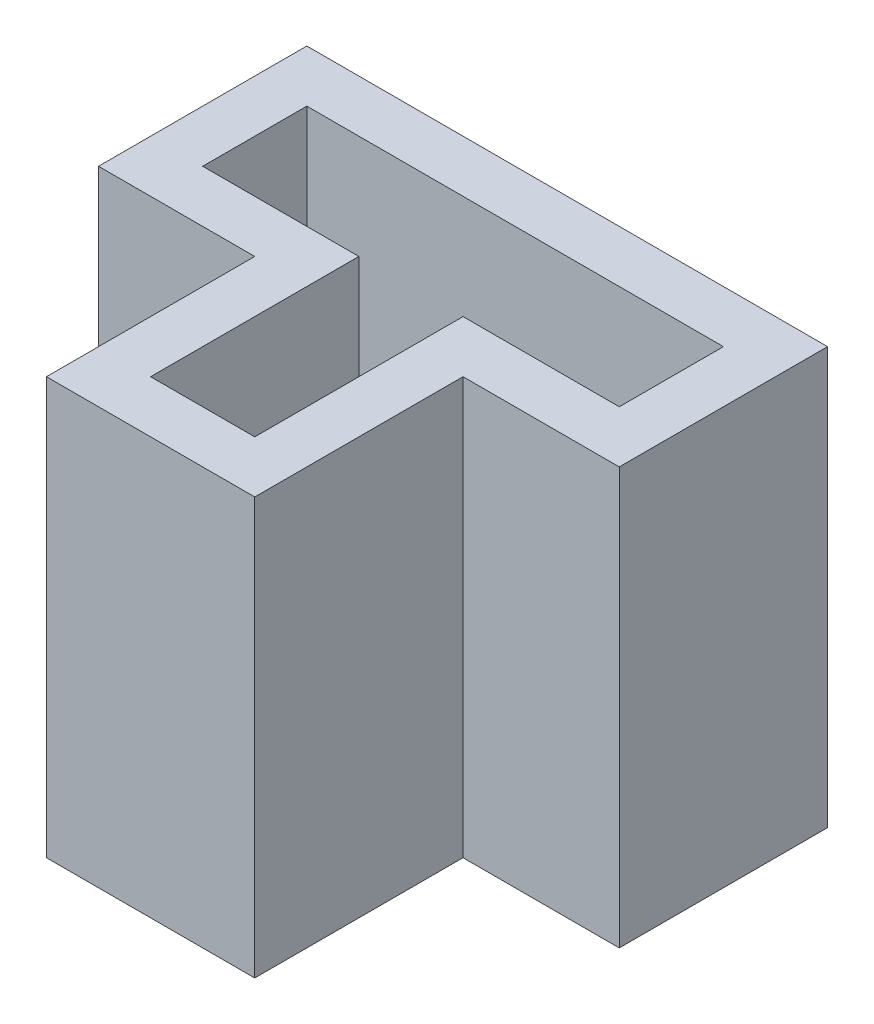
ISO-10303-21;
HEADER;
FILE_DESCRIPTION(('STEP AP214'),'2;1');
FILE_NAME('part.step','',(''),(''),'','','');
FILE_SCHEMA(('AUTOMOTIVE_DESIGN { 1 0 10303 214 1 1 1 1 }'));
ENDSEC;
DATA;
#1=APPLICATION_CONTEXT('core data for automotive mechanical design processes');
#2=APPLICATION_PROTOCOL_DEFINITION('international standard','automotive_design',2000,#1);
#3=PRODUCT_CONTEXT('',#1,'mechanical');
#4=PRODUCT('Part','Part','',(#3));
#5=PRODUCT_RELATED_PRODUCT_CATEGORY('part','',(#4));
#6=PRODUCT_DEFINITION_FORMATION('','',#4);
#7=PRODUCT_DEFINITION_CONTEXT('part definition',#1,'design');
#8=PRODUCT_DEFINITION('design','',#6,#7);
#9=PRODUCT_DEFINITION_SHAPE('','',#8);
#10=(LENGTH_UNIT() NAMED_UNIT(*) SI_UNIT(.MILLI.,.METRE.));
#11=(NAMED_UNIT(*) PLANE_ANGLE_UNIT() SI_UNIT($,.RADIAN.));
#12=(NAMED_UNIT(*) SI_UNIT($,.STERADIAN.) SOLID_ANGLE_UNIT());
#13=UNCERTAINTY_MEASURE_WITH_UNIT(LENGTH_MEASURE(1.E-05),#10,'distance_accuracy_value','');
#14=(GEOMETRIC_REPRESENTATION_CONTEXT(3) GLOBAL_UNCERTAINTY_ASSIGNED_CONTEXT((#13)) GLOBAL_UNIT_ASSIGNED_CONTEXT((#10,
#11,#12)) REPRESENTATION_CONTEXT('',''));
#15=CARTESIAN_POINT('',(0.,0.,0.));
#16=DIRECTION('',(0.,0.,1.));
#17=DIRECTION('',(1.,0.,0.));
#18=AXIS2_PLACEMENT_3D('',#15,#16,#17);
#19=CARTESIAN_POINT('',(32.948717948718,-40.,15.8119658119658));
#20=DIRECTION('',(1.,0.,0.));
#21=DIRECTION('',(0.,0.,-1.));
#22=AXIS2_PLACEMENT_3D('',#19,#20,#21);
#23=PLANE('',#22);
#24=DIRECTION('',(0.,0.,-1.));
#25=VECTOR('',#24,1.);
#26=CARTESIAN_POINT('',(32.948717948718,0.,15.8119658119658));
#27=LINE('',#26,#25);
#28=CARTESIAN_POINT('',(32.948717948718,0.,15.8119658119658));
#29=VERTEX_POINT('',#28);
#30=CARTESIAN_POINT('',(32.948717948718,0.,-4.1880341880342));
#31=VERTEX_POINT('',#30);
#32=EDGE_CURVE('E229',#29,#31,#27,.T.);
#33=ORIENTED_EDGE('',*,*,#32,.F.);
#34=DIRECTION('',(0.,1.,0.));
#35=VECTOR('',#34,1.);
#36=CARTESIAN_POINT('',(32.948717948718,-40.,15.8119658119658));
#37=LINE('',#36,#35);
#38=CARTESIAN_POINT('',(32.948717948718,-40.,15.8119658119658));
#39=VERTEX_POINT('',#38);
#40=EDGE_CURVE('E11',#39,#29,#37,.T.);
#41=ORIENTED_EDGE('',*,*,#40,.F.);
#42=DIRECTION('',(0.,0.,-1.));
#43=VECTOR('',#42,1.);
#44=CARTESIAN_POINT('',(32.948717948718,-40.,15.8119658119658));
#45=LINE('',#44,#43);
#46=CARTESIAN_POINT('',(32.948717948718,-40.,-4.1880341880342));
#47=VERTEX_POINT('',#46);
#48=EDGE_CURVE('E247',#39,#47,#45,.T.);
#49=ORIENTED_EDGE('',*,*,#48,.T.);
#50=DIRECTION('',(0.,1.,0.));
#51=VECTOR('',#50,1.);
#52=CARTESIAN_POINT('',(32.948717948718,-40.,-4.1880341880342));
#53=LINE('',#52,#51);
#54=EDGE_CURVE('E43',#47,#31,#53,.T.);
#55=ORIENTED_EDGE('',*,*,#54,.T.);
#56=EDGE_LOOP('',(#33,#41,#49,#55));
#57=FACE_BOUND('',#56,.T.);
#58=ADVANCED_FACE('F40',(#57),#23,.T.);
#59=CARTESIAN_POINT('',(17.948717948718,-40.,15.8119658119658));
#60=DIRECTION('',(0.,0.,1.));
#61=DIRECTION('',(1.,0.,0.));
#62=AXIS2_PLACEMENT_3D('',#59,#60,#61);
#63=PLANE('',#62);
#64=DIRECTION('',(1.,0.,0.));
#65=VECTOR('',#64,1.);
#66=CARTESIAN_POINT('',(17.948717948718,0.,15.8119658119658));
#67=LINE('',#66,#65);
#68=CARTESIAN_POINT('',(17.948717948718,0.,15.8119658119658));
#69=VERTEX_POINT('',#68);
#70=EDGE_CURVE('E252',#69,#29,#67,.T.);
#71=ORIENTED_EDGE('',*,*,#70,.F.);
#72=DIRECTION('',(0.,1.,0.));
#73=VECTOR('',#72,1.);
#74=CARTESIAN_POINT('',(17.948717948718,-40.,15.8119658119658));
#75=LINE('',#74,#73);
#76=CARTESIAN_POINT('',(17.948717948718,-40.,15.8119658119658));
#77=VERTEX_POINT('',#76);
#78=EDGE_CURVE('E49',#77,#69,#75,.T.);
#79=ORIENTED_EDGE('',*,*,#78,.F.);
#80=DIRECTION('',(1.,0.,0.));
#81=VECTOR('',#80,1.);
#82=CARTESIAN_POINT('',(17.948717948718,-40.,15.8119658119658));
#83=LINE('',#82,#81);
#84=EDGE_CURVE('E276',#77,#39,#83,.T.);
#85=ORIENTED_EDGE('',*,*,#84,.T.);
#86=ORIENTED_EDGE('',*,*,#40,.T.);
#87=EDGE_LOOP('',(#71,#79,#85,#86));
#88=FACE_BOUND('',#87,.T.);
#89=ADVANCED_FACE('F339',(#88),#63,.T.);
#90=CARTESIAN_POINT('',(17.948717948718,-40.,35.8119658119658));
#91=DIRECTION('',(1.,0.,0.));
#92=DIRECTION('',(0.,0.,-1.));
#93=AXIS2_PLACEMENT_3D('',#90,#91,#92);
#94=PLANE('',#93);
#95=DIRECTION('',(0.,0.,-1.));
#96=VECTOR('',#95,1.);
#97=CARTESIAN_POINT('',(17.948717948718,0.,35.8119658119658));
#98=LINE('',#97,#96);
#99=CARTESIAN_POINT('',(17.948717948718,0.,35.8119658119658));
#100=VERTEX_POINT('',#99);
#101=EDGE_CURVE('E303',#100,#69,#98,.T.);
#102=ORIENTED_EDGE('',*,*,#101,.F.);
#103=DIRECTION('',(0.,1.,0.));
#104=VECTOR('',#103,1.);
#105=CARTESIAN_POINT('',(17.948717948718,-40.,35.8119658119658));
#106=LINE('',#105,#104);
#107=CARTESIAN_POINT('',(17.948717948718,-40.,35.8119658119658));
#108=VERTEX_POINT('',#107);
#109=EDGE_CURVE('E312',#108,#100,#106,.T.);
#110=ORIENTED_EDGE('',*,*,#109,.F.);
#111=DIRECTION('',(0.,0.,-1.));
#112=VECTOR('',#111,1.);
#113=CARTESIAN_POINT('',(17.948717948718,-40.,35.8119658119658));
#114=LINE('',#113,#112);
#115=EDGE_CURVE('E272',#108,#77,#114,.T.);
#116=ORIENTED_EDGE('',*,*,#115,.T.);
#117=ORIENTED_EDGE('',*,*,#78,.T.);
#118=EDGE_LOOP('',(#102,#110,#116,#117));
#119=FACE_BOUND('',#118,.T.);
#120=ADVANCED_FACE('F358',(#119),#94,.T.);
#121=CARTESIAN_POINT('',(-2.05128205128204,-40.,35.8119658119658));
#122=DIRECTION('',(0.,0.,1.));
#123=DIRECTION('',(1.,0.,0.));
#124=AXIS2_PLACEMENT_3D('',#121,#122,#123);
#125=PLANE('',#124);
#126=DIRECTION('',(1.,0.,0.));
#127=VECTOR('',#126,1.);
#128=CARTESIAN_POINT('',(-2.05128205128204,0.,35.8119658119658));
#129=LINE('',#128,#127);
#130=CARTESIAN_POINT('',(-2.05128205128204,0.,35.8119658119658));
#131=VERTEX_POINT('',#130);
#132=EDGE_CURVE('E299',#131,#100,#129,.T.);
#133=ORIENTED_EDGE('',*,*,#132,.F.);
#134=DIRECTION('',(0.,1.,0.));
#135=VECTOR('',#134,1.);
#136=CARTESIAN_POINT('',(-2.05128205128204,-40.,35.8119658119658));
#137=LINE('',#136,#135);
#138=CARTESIAN_POINT('',(-2.05128205128204,-40.,35.8119658119658));
#139=VERTEX_POINT('',#138);
#140=EDGE_CURVE('E315',#139,#131,#137,.T.);
#141=ORIENTED_EDGE('',*,*,#140,.F.);
#142=DIRECTION('',(1.,0.,0.));
#143=VECTOR('',#142,1.);
#144=CARTESIAN_POINT('',(-2.05128205128204,-40.,35.8119658119658));
#145=LINE('',#144,#143);
#146=EDGE_CURVE('E268',#139,#108,#145,.T.);
#147=ORIENTED_EDGE('',*,*,#146,.T.);
#148=ORIENTED_EDGE('',*,*,#109,.T.);
#149=EDGE_LOOP('',(#133,#141,#147,#148));
#150=FACE_BOUND('',#149,.T.);
#151=ADVANCED_FACE('F356',(#150),#125,.T.);
#152=CARTESIAN_POINT('',(-2.05128205128204,-40.,15.8119658119658));
#153=DIRECTION('',(-1.,0.,0.));
#154=DIRECTION('',(0.,0.,1.));
#155=AXIS2_PLACEMENT_3D('',#152,#153,#154);
#156=PLANE('',#155);
#157=DIRECTION('',(0.,0.,1.));
#158=VECTOR('',#157,1.);
#159=CARTESIAN_POINT('',(-2.05128205128204,0.,15.8119658119658));
#160=LINE('',#159,#158);
#161=CARTESIAN_POINT('',(-2.05128205128204,0.,15.8119658119658));
#162=VERTEX_POINT('',#161);
#163=EDGE_CURVE('E295',#162,#131,#160,.T.);
#164=ORIENTED_EDGE('',*,*,#163,.F.);
#165=DIRECTION('',(0.,1.,0.));
#166=VECTOR('',#165,1.);
#167=CARTESIAN_POINT('',(-2.05128205128204,-40.,15.8119658119658));
#168=LINE('',#167,#166);
#169=CARTESIAN_POINT('',(-2.05128205128204,-40.,15.8119658119658));
#170=VERTEX_POINT('',#169);
#171=EDGE_CURVE('E318',#170,#162,#168,.T.);
#172=ORIENTED_EDGE('',*,*,#171,.F.);
#173=DIRECTION('',(0.,0.,1.));
#174=VECTOR('',#173,1.);
#175=CARTESIAN_POINT('',(-2.05128205128204,-40.,15.8119658119658));
#176=LINE('',#175,#174);
#177=EDGE_CURVE('E264',#170,#139,#176,.T.);
#178=ORIENTED_EDGE('',*,*,#177,.T.);
#179=ORIENTED_EDGE('',*,*,#140,.T.);
#180=EDGE_LOOP('',(#164,#172,#178,#179));
#181=FACE_BOUND('',#180,.T.);
#182=ADVANCED_FACE('F352',(#181),#156,.T.);
#183=CARTESIAN_POINT('',(-17.051282051282,-40.,15.8119658119658));
#184=DIRECTION('',(0.,0.,1.));
#185=DIRECTION('',(1.,0.,0.));
#186=AXIS2_PLACEMENT_3D('',#183,#184,#185);
#187=PLANE('',#186);
#188=DIRECTION('',(1.,0.,0.));
#189=VECTOR('',#188,1.);
#190=CARTESIAN_POINT('',(-17.051282051282,0.,15.8119658119658));
#191=LINE('',#190,#189);
#192=CARTESIAN_POINT('',(-17.051282051282,0.,15.8119658119658));
#193=VERTEX_POINT('',#192);
#194=EDGE_CURVE('E291',#193,#162,#191,.T.);
#195=ORIENTED_EDGE('',*,*,#194,.F.);
#196=DIRECTION('',(0.,1.,0.));
#197=VECTOR('',#196,1.);
#198=CARTESIAN_POINT('',(-17.051282051282,-40.,15.8119658119658));
#199=LINE('',#198,#197);
#200=CARTESIAN_POINT('',(-17.051282051282,-40.,15.8119658119658));
#201=VERTEX_POINT('',#200);
#202=EDGE_CURVE('E321',#201,#193,#199,.T.);
#203=ORIENTED_EDGE('',*,*,#202,.F.);
#204=DIRECTION('',(1.,0.,0.));
#205=VECTOR('',#204,1.);
#206=CARTESIAN_POINT('',(-17.051282051282,-40.,15.8119658119658));
#207=LINE('',#206,#205);
#208=EDGE_CURVE('E260',#201,#170,#207,.T.);
#209=ORIENTED_EDGE('',*,*,#208,.T.);
#210=ORIENTED_EDGE('',*,*,#171,.T.);
#211=EDGE_LOOP('',(#195,#203,#209,#210));
#212=FACE_BOUND('',#211,.T.);
#213=ADVANCED_FACE('F350',(#212),#187,.T.);
#214=CARTESIAN_POINT('',(-17.051282051282,-40.,-4.18803418803419));
#215=DIRECTION('',(-1.,0.,0.));
#216=DIRECTION('',(0.,0.,1.));
#217=AXIS2_PLACEMENT_3D('',#214,#215,#216);
#218=PLANE('',#217);
#219=DIRECTION('',(0.,0.,1.));
#220=VECTOR('',#219,1.);
#221=CARTESIAN_POINT('',(-17.051282051282,0.,-4.18803418803419));
#222=LINE('',#221,#220);
#223=CARTESIAN_POINT('',(-17.051282051282,0.,-4.18803418803419));
#224=VERTEX_POINT('',#223);
#225=EDGE_CURVE('E287',#224,#193,#222,.T.);
#226=ORIENTED_EDGE('',*,*,#225,.F.);
#227=DIRECTION('',(0.,1.,0.));
#228=VECTOR('',#227,1.);
#229=CARTESIAN_POINT('',(-17.051282051282,-40.,-4.18803418803419));
#230=LINE('',#229,#228);
#231=CARTESIAN_POINT('',(-17.051282051282,-40.,-4.18803418803419));
#232=VERTEX_POINT('',#231);
#233=EDGE_CURVE('E323',#232,#224,#230,.T.);
#234=ORIENTED_EDGE('',*,*,#233,.F.);
#235=DIRECTION('',(0.,0.,1.));
#236=VECTOR('',#235,1.);
#237=CARTESIAN_POINT('',(-17.051282051282,-40.,-4.18803418803419));
#238=LINE('',#237,#236);
#239=EDGE_CURVE('E256',#232,#201,#238,.T.);
#240=ORIENTED_EDGE('',*,*,#239,.T.);
#241=ORIENTED_EDGE('',*,*,#202,.T.);
#242=EDGE_LOOP('',(#226,#234,#240,#241));
#243=FACE_BOUND('',#242,.T.);
#244=ADVANCED_FACE('F346',(#243),#218,.T.);
#245=CARTESIAN_POINT('',(32.948717948718,-40.,-4.1880341880342));
#246=DIRECTION('',(0.,0.,-1.));
#247=DIRECTION('',(-1.,0.,0.));
#248=AXIS2_PLACEMENT_3D('',#245,#246,#247);
#249=PLANE('',#248);
#250=DIRECTION('',(-1.,0.,0.));
#251=VECTOR('',#250,1.);
#252=CARTESIAN_POINT('',(32.948717948718,0.,-4.1880341880342));
#253=LINE('',#252,#251);
#254=EDGE_CURVE('E283',#31,#224,#253,.T.);
#255=ORIENTED_EDGE('',*,*,#254,.F.);
#256=ORIENTED_EDGE('',*,*,#54,.F.);
#257=DIRECTION('',(-1.,0.,0.));
#258=VECTOR('',#257,1.);
#259=CARTESIAN_POINT('',(32.948717948718,-40.,-4.1880341880342));
#260=LINE('',#259,#258);
#261=EDGE_CURVE('E251',#47,#232,#260,.T.);
#262=ORIENTED_EDGE('',*,*,#261,.T.);
#263=ORIENTED_EDGE('',*,*,#233,.T.);
#264=EDGE_LOOP('',(#255,#256,#262,#263));
#265=FACE_BOUND('',#264,.T.);
#266=ADVANCED_FACE('F333',(#265),#249,.T.);
#267=CARTESIAN_POINT('',(0.,-40.,0.));
#268=DIRECTION('',(0.,1.,0.));
#269=DIRECTION('',(0.,0.,1.));
#270=AXIS2_PLACEMENT_3D('',#267,#268,#269);
#271=PLANE('',#270);
#272=DIRECTION('',(-1.,0.,0.));
#273=VECTOR('',#272,1.);
#274=CARTESIAN_POINT('',(27.948717948718,-40.,0.811965811965801));
#275=LINE('',#274,#273);
#276=CARTESIAN_POINT('',(27.948717948718,-40.,0.811965811965801));
#277=VERTEX_POINT('',#276);
#278=CARTESIAN_POINT('',(-12.051282051282,-40.,0.811965811965807));
#279=VERTEX_POINT('',#278);
#280=EDGE_CURVE('E163',#277,#279,#275,.T.);
#281=ORIENTED_EDGE('',*,*,#280,.T.);
#282=DIRECTION('',(0.,0.,1.));
#283=VECTOR('',#282,1.);
#284=CARTESIAN_POINT('',(-12.051282051282,-40.,0.811965811965807));
#285=LINE('',#284,#283);
#286=CARTESIAN_POINT('',(-12.051282051282,-40.,10.8119658119658));
#287=VERTEX_POINT('',#286);
#288=EDGE_CURVE('E156',#279,#287,#285,.T.);
#289=ORIENTED_EDGE('',*,*,#288,.T.);
#290=DIRECTION('',(1.,0.,0.));
#291=VECTOR('',#290,1.);
#292=CARTESIAN_POINT('',(-12.051282051282,-40.,10.8119658119658));
#293=LINE('',#292,#291);
#294=CARTESIAN_POINT('',(2.94871794871796,-40.,10.8119658119658));
#295=VERTEX_POINT('',#294);
#296=EDGE_CURVE('E166',#287,#295,#293,.T.);
#297=ORIENTED_EDGE('',*,*,#296,.T.);
#298=DIRECTION('',(0.,0.,1.));
#299=VECTOR('',#298,1.);
#300=CARTESIAN_POINT('',(2.94871794871796,-40.,10.8119658119658));
#301=LINE('',#300,#299);
#302=CARTESIAN_POINT('',(2.94871794871796,-40.,30.8119658119658));
#303=VERTEX_POINT('',#302);
#304=EDGE_CURVE('E57',#295,#303,#301,.T.);
#305=ORIENTED_EDGE('',*,*,#304,.T.);
#306=DIRECTION('',(1.,0.,0.));
#307=VECTOR('',#306,1.);
#308=CARTESIAN_POINT('',(2.94871794871796,-40.,30.8119658119658));
#309=LINE('',#308,#307);
#310=CARTESIAN_POINT('',(12.948717948718,-40.,30.8119658119658));
#311=VERTEX_POINT('',#310);
#312=EDGE_CURVE('E185',#303,#311,#309,.T.);
#313=ORIENTED_EDGE('',*,*,#312,.T.);
#314=DIRECTION('',(0.,0.,-1.));
#315=VECTOR('',#314,1.);
#316=CARTESIAN_POINT('',(12.948717948718,-40.,30.8119658119658));
#317=LINE('',#316,#315);
#318=CARTESIAN_POINT('',(12.948717948718,-40.,10.8119658119658));
#319=VERTEX_POINT('',#318);
#320=EDGE_CURVE('E189',#311,#319,#317,.T.);
#321=ORIENTED_EDGE('',*,*,#320,.T.);
#322=DIRECTION('',(1.,0.,0.));
#323=VECTOR('',#322,1.);
#324=CARTESIAN_POINT('',(12.948717948718,-40.,10.8119658119658));
#325=LINE('',#324,#323);
#326=CARTESIAN_POINT('',(27.948717948718,-40.,10.8119658119658));
#327=VERTEX_POINT('',#326);
#328=EDGE_CURVE('E193',#319,#327,#325,.T.);
#329=ORIENTED_EDGE('',*,*,#328,.T.);
#330=DIRECTION('',(0.,0.,-1.));
#331=VECTOR('',#330,1.);
#332=CARTESIAN_POINT('',(27.948717948718,-40.,10.8119658119658));
#333=LINE('',#332,#331);
#334=EDGE_CURVE('E197',#327,#277,#333,.T.);
#335=ORIENTED_EDGE('',*,*,#334,.T.);
#336=EDGE_LOOP('',(#281,#289,#297,#305,#313,#321,#329,#335));
#337=FACE_BOUND('',#336,.T.);
#338=ORIENTED_EDGE('',*,*,#48,.F.);
#339=ORIENTED_EDGE('',*,*,#84,.F.);
#340=ORIENTED_EDGE('',*,*,#115,.F.);
#341=ORIENTED_EDGE('',*,*,#146,.F.);
#342=ORIENTED_EDGE('',*,*,#177,.F.);
#343=ORIENTED_EDGE('',*,*,#208,.F.);
#344=ORIENTED_EDGE('',*,*,#239,.F.);
#345=ORIENTED_EDGE('',*,*,#261,.F.);
#346=EDGE_LOOP('',(#338,#339,#340,#341,#342,#343,#344,#345));
#347=FACE_BOUND('',#346,.T.);
#348=ADVANCED_FACE('F171',(#337,#347),#271,.F.);
#349=CARTESIAN_POINT('',(0.,0.,0.));
#350=DIRECTION('',(0.,1.,0.));
#351=DIRECTION('',(0.,0.,1.));
#352=AXIS2_PLACEMENT_3D('',#349,#350,#351);
#353=PLANE('',#352);
#354=DIRECTION('',(0.,0.,1.));
#355=VECTOR('',#354,1.);
#356=CARTESIAN_POINT('',(-12.051282051282,0.,0.811965811965807));
#357=LINE('',#356,#355);
#358=CARTESIAN_POINT('',(-12.051282051282,0.,0.811965811965807));
#359=VERTEX_POINT('',#358);
#360=CARTESIAN_POINT('',(-12.051282051282,0.,10.8119658119658));
#361=VERTEX_POINT('',#360);
#362=EDGE_CURVE('E65',#359,#361,#357,.T.);
#363=ORIENTED_EDGE('',*,*,#362,.F.);
#364=DIRECTION('',(-1.,0.,0.));
#365=VECTOR('',#364,1.);
#366=CARTESIAN_POINT('',(27.948717948718,0.,0.811965811965801));
#367=LINE('',#366,#365);
#368=CARTESIAN_POINT('',(27.948717948718,0.,0.811965811965801));
#369=VERTEX_POINT('',#368);
#370=EDGE_CURVE('E176',#369,#359,#367,.T.);
#371=ORIENTED_EDGE('',*,*,#370,.F.);
#372=DIRECTION('',(0.,0.,-1.));
#373=VECTOR('',#372,1.);
#374=CARTESIAN_POINT('',(27.948717948718,0.,10.8119658119658));
#375=LINE('',#374,#373);
#376=CARTESIAN_POINT('',(27.948717948718,0.,10.8119658119658));
#377=VERTEX_POINT('',#376);
#378=EDGE_CURVE('E180',#377,#369,#375,.T.);
#379=ORIENTED_EDGE('',*,*,#378,.F.);
#380=DIRECTION('',(1.,0.,0.));
#381=VECTOR('',#380,1.);
#382=CARTESIAN_POINT('',(12.948717948718,0.,10.8119658119658));
#383=LINE('',#382,#381);
#384=CARTESIAN_POINT('',(12.948717948718,0.,10.8119658119658));
#385=VERTEX_POINT('',#384);
#386=EDGE_CURVE('E219',#385,#377,#383,.T.);
#387=ORIENTED_EDGE('',*,*,#386,.F.);
#388=DIRECTION('',(0.,0.,-1.));
#389=VECTOR('',#388,1.);
#390=CARTESIAN_POINT('',(12.948717948718,0.,30.8119658119658));
#391=LINE('',#390,#389);
#392=CARTESIAN_POINT('',(12.948717948718,0.,30.8119658119658));
#393=VERTEX_POINT('',#392);
#394=EDGE_CURVE('E215',#393,#385,#391,.T.);
#395=ORIENTED_EDGE('',*,*,#394,.F.);
#396=DIRECTION('',(1.,0.,0.));
#397=VECTOR('',#396,1.);
#398=CARTESIAN_POINT('',(2.94871794871796,0.,30.8119658119658));
#399=LINE('',#398,#397);
#400=CARTESIAN_POINT('',(2.94871794871796,0.,30.8119658119658));
#401=VERTEX_POINT('',#400);
#402=EDGE_CURVE('E211',#401,#393,#399,.T.);
#403=ORIENTED_EDGE('',*,*,#402,.F.);
#404=DIRECTION('',(0.,0.,1.));
#405=VECTOR('',#404,1.);
#406=CARTESIAN_POINT('',(2.94871794871796,0.,10.8119658119658));
#407=LINE('',#406,#405);
#408=CARTESIAN_POINT('',(2.94871794871796,0.,10.8119658119658));
#409=VERTEX_POINT('',#408);
#410=EDGE_CURVE('E207',#409,#401,#407,.T.);
#411=ORIENTED_EDGE('',*,*,#410,.F.);
#412=DIRECTION('',(1.,0.,0.));
#413=VECTOR('',#412,1.);
#414=CARTESIAN_POINT('',(-12.051282051282,0.,10.8119658119658));
#415=LINE('',#414,#413);
#416=EDGE_CURVE('E204',#361,#409,#415,.T.);
#417=ORIENTED_EDGE('',*,*,#416,.F.);
#418=EDGE_LOOP('',(#363,#371,#379,#387,#395,#403,#411,#417));
#419=FACE_BOUND('',#418,.T.);
#420=ORIENTED_EDGE('',*,*,#32,.T.);
#421=ORIENTED_EDGE('',*,*,#254,.T.);
#422=ORIENTED_EDGE('',*,*,#225,.T.);
#423=ORIENTED_EDGE('',*,*,#194,.T.);
#424=ORIENTED_EDGE('',*,*,#163,.T.);
#425=ORIENTED_EDGE('',*,*,#132,.T.);
#426=ORIENTED_EDGE('',*,*,#101,.T.);
#427=ORIENTED_EDGE('',*,*,#70,.T.);
#428=EDGE_LOOP('',(#420,#421,#422,#423,#424,#425,#426,#427));
#429=FACE_BOUND('',#428,.T.);
#430=ADVANCED_FACE('F335',(#419,#429),#353,.T.);
#431=CARTESIAN_POINT('',(-12.051282051282,-40.,0.811965811965807));
#432=DIRECTION('',(-1.,0.,0.));
#433=DIRECTION('',(0.,0.,1.));
#434=AXIS2_PLACEMENT_3D('',#431,#432,#433);
#435=PLANE('',#434);
#436=ORIENTED_EDGE('',*,*,#362,.T.);
#437=DIRECTION('',(0.,1.,0.));
#438=VECTOR('',#437,1.);
#439=CARTESIAN_POINT('',(-12.051282051282,-40.,10.8119658119658));
#440=LINE('',#439,#438);
#441=EDGE_CURVE('E152',#287,#361,#440,.T.);
#442=ORIENTED_EDGE('',*,*,#441,.F.);
#443=ORIENTED_EDGE('',*,*,#288,.F.);
#444=DIRECTION('',(0.,1.,0.));
#445=VECTOR('',#444,1.);
#446=CARTESIAN_POINT('',(-12.051282051282,-40.,0.811965811965807));
#447=LINE('',#446,#445);
#448=EDGE_CURVE('E226',#279,#359,#447,.T.);
#449=ORIENTED_EDGE('',*,*,#448,.T.);
#450=EDGE_LOOP('',(#436,#442,#443,#449));
#451=FACE_BOUND('',#450,.T.);
#452=ADVANCED_FACE('F154',(#451),#435,.F.);
#453=CARTESIAN_POINT('',(27.948717948718,-40.,0.811965811965801));
#454=DIRECTION('',(0.,0.,-1.));
#455=DIRECTION('',(-1.,0.,0.));
#456=AXIS2_PLACEMENT_3D('',#453,#454,#455);
#457=PLANE('',#456);
#458=ORIENTED_EDGE('',*,*,#370,.T.);
#459=ORIENTED_EDGE('',*,*,#448,.F.);
#460=ORIENTED_EDGE('',*,*,#280,.F.);
#461=DIRECTION('',(0.,1.,0.));
#462=VECTOR('',#461,1.);
#463=CARTESIAN_POINT('',(27.948717948718,-40.,0.811965811965801));
#464=LINE('',#463,#462);
#465=EDGE_CURVE('E230',#277,#369,#464,.T.);
#466=ORIENTED_EDGE('',*,*,#465,.T.);
#467=EDGE_LOOP('',(#458,#459,#460,#466));
#468=FACE_BOUND('',#467,.T.);
#469=ADVANCED_FACE('F441',(#468),#457,.F.);
#470=CARTESIAN_POINT('',(27.948717948718,-40.,10.8119658119658));
#471=DIRECTION('',(1.,0.,0.));
#472=DIRECTION('',(0.,0.,-1.));
#473=AXIS2_PLACEMENT_3D('',#470,#471,#472);
#474=PLANE('',#473);
#475=ORIENTED_EDGE('',*,*,#378,.T.);
#476=ORIENTED_EDGE('',*,*,#465,.F.);
#477=ORIENTED_EDGE('',*,*,#334,.F.);
#478=DIRECTION('',(0.,1.,0.));
#479=VECTOR('',#478,1.);
#480=CARTESIAN_POINT('',(27.948717948718,-40.,10.8119658119658));
#481=LINE('',#480,#479);
#482=EDGE_CURVE('E233',#327,#377,#481,.T.);
#483=ORIENTED_EDGE('',*,*,#482,.T.);
#484=EDGE_LOOP('',(#475,#476,#477,#483));
#485=FACE_BOUND('',#484,.T.);
#486=ADVANCED_FACE('F450',(#485),#474,.F.);
#487=CARTESIAN_POINT('',(12.948717948718,-40.,10.8119658119658));
#488=DIRECTION('',(0.,0.,1.));
#489=DIRECTION('',(1.,0.,0.));
#490=AXIS2_PLACEMENT_3D('',#487,#488,#489);
#491=PLANE('',#490);
#492=ORIENTED_EDGE('',*,*,#386,.T.);
#493=ORIENTED_EDGE('',*,*,#482,.F.);
#494=ORIENTED_EDGE('',*,*,#328,.F.);
#495=DIRECTION('',(0.,1.,0.));
#496=VECTOR('',#495,1.);
#497=CARTESIAN_POINT('',(12.948717948718,-40.,10.8119658119658));
#498=LINE('',#497,#496);
#499=EDGE_CURVE('E236',#319,#385,#498,.T.);
#500=ORIENTED_EDGE('',*,*,#499,.T.);
#501=EDGE_LOOP('',(#492,#493,#494,#500));
#502=FACE_BOUND('',#501,.T.);
#503=ADVANCED_FACE('F460',(#502),#491,.F.);
#504=CARTESIAN_POINT('',(12.948717948718,-40.,30.8119658119658));
#505=DIRECTION('',(1.,0.,0.));
#506=DIRECTION('',(0.,0.,-1.));
#507=AXIS2_PLACEMENT_3D('',#504,#505,#506);
#508=PLANE('',#507);
#509=ORIENTED_EDGE('',*,*,#394,.T.);
#510=ORIENTED_EDGE('',*,*,#499,.F.);
#511=ORIENTED_EDGE('',*,*,#320,.F.);
#512=DIRECTION('',(0.,1.,0.));
#513=VECTOR('',#512,1.);
#514=CARTESIAN_POINT('',(12.948717948718,-40.,30.8119658119658));
#515=LINE('',#514,#513);
#516=EDGE_CURVE('E239',#311,#393,#515,.T.);
#517=ORIENTED_EDGE('',*,*,#516,.T.);
#518=EDGE_LOOP('',(#509,#510,#511,#517));
#519=FACE_BOUND('',#518,.T.);
#520=ADVANCED_FACE('F470',(#519),#508,.F.);
#521=CARTESIAN_POINT('',(2.94871794871796,-40.,30.8119658119658));
#522=DIRECTION('',(0.,0.,1.));
#523=DIRECTION('',(1.,0.,0.));
#524=AXIS2_PLACEMENT_3D('',#521,#522,#523);
#525=PLANE('',#524);
#526=ORIENTED_EDGE('',*,*,#402,.T.);
#527=ORIENTED_EDGE('',*,*,#516,.F.);
#528=ORIENTED_EDGE('',*,*,#312,.F.);
#529=DIRECTION('',(0.,1.,0.));
#530=VECTOR('',#529,1.);
#531=CARTESIAN_POINT('',(2.94871794871796,-40.,30.8119658119658));
#532=LINE('',#531,#530);
#533=EDGE_CURVE('E242',#303,#401,#532,.T.);
#534=ORIENTED_EDGE('',*,*,#533,.T.);
#535=EDGE_LOOP('',(#526,#527,#528,#534));
#536=FACE_BOUND('',#535,.T.);
#537=ADVANCED_FACE('F480',(#536),#525,.F.);
#538=CARTESIAN_POINT('',(2.94871794871796,-40.,10.8119658119658));
#539=DIRECTION('',(-1.,0.,0.));
#540=DIRECTION('',(0.,0.,1.));
#541=AXIS2_PLACEMENT_3D('',#538,#539,#540);
#542=PLANE('',#541);
#543=ORIENTED_EDGE('',*,*,#410,.T.);
#544=ORIENTED_EDGE('',*,*,#533,.F.);
#545=ORIENTED_EDGE('',*,*,#304,.F.);
#546=DIRECTION('',(0.,1.,0.));
#547=VECTOR('',#546,1.);
#548=CARTESIAN_POINT('',(2.94871794871796,-40.,10.8119658119658));
#549=LINE('',#548,#547);
#550=EDGE_CURVE('E162',#295,#409,#549,.T.);
#551=ORIENTED_EDGE('',*,*,#550,.T.);
#552=EDGE_LOOP('',(#543,#544,#545,#551));
#553=FACE_BOUND('',#552,.T.);
#554=ADVANCED_FACE('F490',(#553),#542,.F.);
#555=CARTESIAN_POINT('',(-12.051282051282,-40.,10.8119658119658));
#556=DIRECTION('',(0.,0.,1.));
#557=DIRECTION('',(1.,0.,0.));
#558=AXIS2_PLACEMENT_3D('',#555,#556,#557);
#559=PLANE('',#558);
#560=ORIENTED_EDGE('',*,*,#416,.T.);
#561=ORIENTED_EDGE('',*,*,#550,.F.);
#562=ORIENTED_EDGE('',*,*,#296,.F.);
#563=ORIENTED_EDGE('',*,*,#441,.T.);
#564=EDGE_LOOP('',(#560,#561,#562,#563));
#565=FACE_BOUND('',#564,.T.);
#566=ADVANCED_FACE('F167',(#565),#559,.F.);
#567=CLOSED_SHELL('',(#58,#89,#120,#151,#182,#213,#244,#266,#348,#430,#452,#469,#486,#503,#520,
#537,#554,#566));
#568=MANIFOLD_SOLID_BREP('B2',#567);
#569=ADVANCED_BREP_SHAPE_REPRESENTATION('',(#18,#568),#14);
#570=SHAPE_DEFINITION_REPRESENTATION(#9,#569);
ENDSEC;
END-ISO-10303-21;
